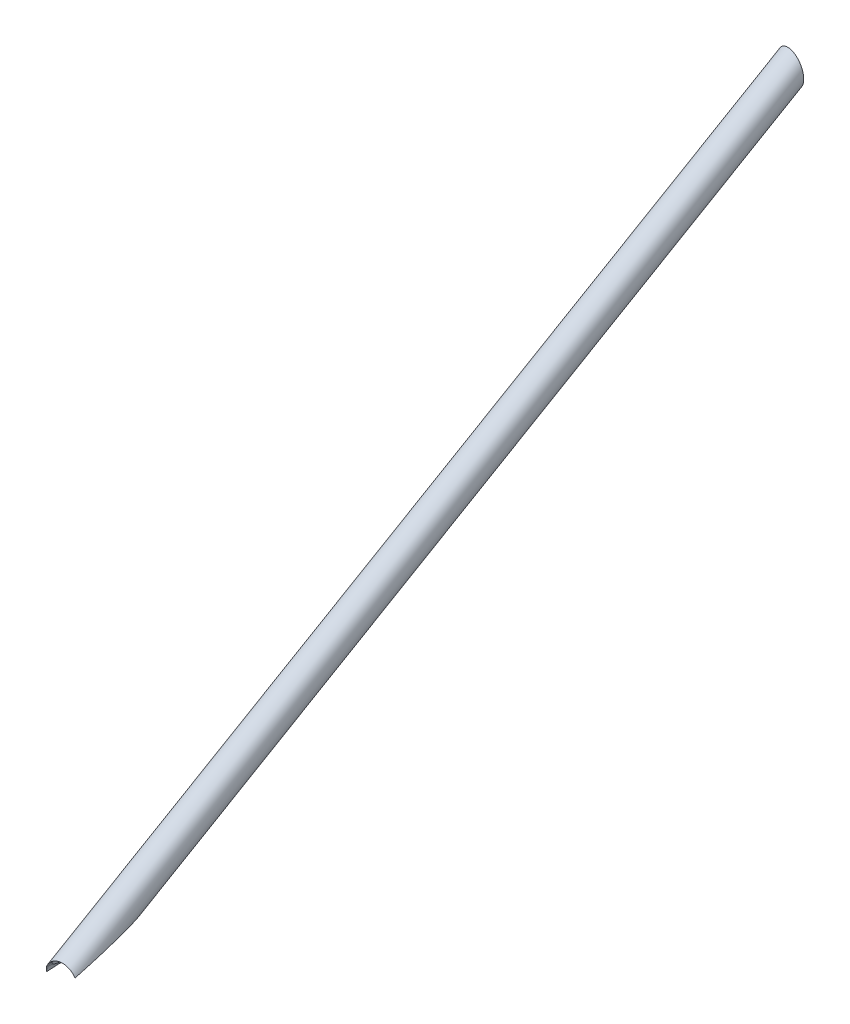
ISO-10303-21;
HEADER;
FILE_DESCRIPTION(('STEP AP214'),'2;1');
FILE_NAME('part.step','',(''),(''),'','','');
FILE_SCHEMA(('AUTOMOTIVE_DESIGN { 1 0 10303 214 1 1 1 1 }'));
ENDSEC;
DATA;
#1=APPLICATION_CONTEXT('core data for automotive mechanical design processes');
#2=APPLICATION_PROTOCOL_DEFINITION('international standard','automotive_design',2000,#1);
#3=PRODUCT_CONTEXT('',#1,'mechanical');
#4=PRODUCT('Part','Part','',(#3));
#5=PRODUCT_RELATED_PRODUCT_CATEGORY('part','',(#4));
#6=PRODUCT_DEFINITION_FORMATION('','',#4);
#7=PRODUCT_DEFINITION_CONTEXT('part definition',#1,'design');
#8=PRODUCT_DEFINITION('design','',#6,#7);
#9=PRODUCT_DEFINITION_SHAPE('','',#8);
#10=(LENGTH_UNIT() NAMED_UNIT(*) SI_UNIT(.MILLI.,.METRE.));
#11=(NAMED_UNIT(*) PLANE_ANGLE_UNIT() SI_UNIT($,.RADIAN.));
#12=(NAMED_UNIT(*) SI_UNIT($,.STERADIAN.) SOLID_ANGLE_UNIT());
#13=UNCERTAINTY_MEASURE_WITH_UNIT(LENGTH_MEASURE(1.E-05),#10,'distance_accuracy_value','');
#14=(GEOMETRIC_REPRESENTATION_CONTEXT(3) GLOBAL_UNCERTAINTY_ASSIGNED_CONTEXT((#13)) GLOBAL_UNIT_ASSIGNED_CONTEXT((#10,
#11,#12)) REPRESENTATION_CONTEXT('',''));
#15=CARTESIAN_POINT('',(0.,0.,0.));
#16=DIRECTION('',(0.,0.,1.));
#17=DIRECTION('',(1.,0.,0.));
#18=AXIS2_PLACEMENT_3D('',#15,#16,#17);
#19=CARTESIAN_POINT('',(159.999999999996,499.999999999997,-1140.));
#20=DIRECTION('',(0.0860700691861919,-0.397246473166977,0.913666888284063));
#21=DIRECTION('',(0.,-0.917070056253238,-0.398726111414444));
#22=AXIS2_PLACEMENT_3D('',#19,#20,#21);
#23=CYLINDRICAL_SURFACE('',#22,11.3);
#24=CARTESIAN_POINT('',(159.999999999996,499.999999999997,-1140.));
#25=DIRECTION('',(0.133991346812795,0.0219122293107126,-0.990740214781821));
#26=DIRECTION('',(0.480296136468897,-0.875921056969798,0.0455842434396295));
#27=AXIS2_PLACEMENT_3D('',#24,#25,#26);
#28=ELLIPSE('',#27,12.5224622988998,11.3);
#29=CARTESIAN_POINT('',(166.014490261235,489.03131158728,-1139.4291730301));
#30=VERTEX_POINT('',#29);
#31=EDGE_CURVE('E112',#30,#30,#28,.T.);
#32=ORIENTED_EDGE('',*,*,#31,.T.);
#33=EDGE_LOOP('',(#32));
#34=FACE_BOUND('',#33,.T.);
#35=CARTESIAN_POINT('',(219.876049960598,213.286108546212,-508.898305477288));
#36=CARTESIAN_POINT('',(219.925483847291,213.354795721992,-509.056281000279));
#37=CARTESIAN_POINT('',(219.975743548204,213.423883720816,-509.2138220252));
#38=CARTESIAN_POINT('',(220.078066840447,213.562925288516,-509.527935243912));
#39=CARTESIAN_POINT('',(220.130130449182,213.63287886574,-509.684507428336));
#40=CARTESIAN_POINT('',(220.289264202963,213.844150460932,-510.152666870754));
#41=CARTESIAN_POINT('',(220.399261495153,213.986857322774,-510.462646218657));
#42=CARTESIAN_POINT('',(220.62878344918,214.276818323832,-511.077654730416));
#43=CARTESIAN_POINT('',(220.748324425629,214.42407997426,-511.382674296276));
#44=CARTESIAN_POINT('',(220.998849656438,214.723684984896,-511.985406548575));
#45=CARTESIAN_POINT('',(221.129831133415,214.87602710621,-512.283120986106));
#46=CARTESIAN_POINT('',(221.36002583754,215.134861783579,-512.77047294297));
#47=CARTESIAN_POINT('',(221.455196795115,215.239632171699,-512.962929319024));
#48=CARTESIAN_POINT('',(221.653207676307,215.452315624128,-513.342055814529));
#49=CARTESIAN_POINT('',(221.756046036483,215.560228045033,-513.528727102671));
#50=CARTESIAN_POINT('',(221.97073552698,215.779387311004,-513.893895588268));
#51=CARTESIAN_POINT('',(222.082558845123,215.890623244288,-514.072415516781));
#52=CARTESIAN_POINT('',(222.317635528396,216.117255739658,-514.418890915909));
#53=CARTESIAN_POINT('',(222.440879837971,216.232648961853,-514.586854582074));
#54=CARTESIAN_POINT('',(222.677468191565,216.446208517778,-514.877565358464));
#55=CARTESIAN_POINT('',(222.788348152903,216.543557008199,-515.002891667427));
#56=CARTESIAN_POINT('',(223.022116940828,216.741885969738,-515.239613409516));
#57=CARTESIAN_POINT('',(223.145030630377,216.842873675927,-515.350978868094));
#58=CARTESIAN_POINT('',(223.406901663051,217.049502941763,-515.554362570307));
#59=CARTESIAN_POINT('',(223.546067378769,217.155190967004,-515.646073996865));
#60=CARTESIAN_POINT('',(223.840274307233,217.367734322353,-515.796752651344));
#61=CARTESIAN_POINT('',(223.99523293654,217.474581208905,-515.855880803837));
#62=CARTESIAN_POINT('',(224.2563517605,217.644194274855,-515.914159888442));
#63=CARTESIAN_POINT('',(224.358492535157,217.70818171871,-515.927604119596));
#64=CARTESIAN_POINT('',(224.565514530137,217.832706713189,-515.934379784523));
#65=CARTESIAN_POINT('',(224.670393076434,217.893247458978,-515.927730165574));
#66=CARTESIAN_POINT('',(224.879896537269,218.008952203589,-515.893723428398));
#67=CARTESIAN_POINT('',(224.984521058141,218.064110354605,-515.866344065415));
#68=CARTESIAN_POINT('',(225.190421952512,218.167676293351,-515.792706355293));
#69=CARTESIAN_POINT('',(225.291694597986,218.216076745588,-515.746427703489));
#70=CARTESIAN_POINT('',(225.523878503193,218.321690650928,-515.619110029616));
#71=CARTESIAN_POINT('',(225.652538077436,218.37592670027,-515.531562873306));
#72=CARTESIAN_POINT('',(225.898558616638,218.47265436529,-515.336457772622));
#73=CARTESIAN_POINT('',(226.015890706233,218.51511645729,-515.228850635802));
#74=CARTESIAN_POINT('',(226.22872585918,218.586582643463,-515.011580401279));
#75=CARTESIAN_POINT('',(226.325239693355,218.616504075181,-514.903180914467));
#76=CARTESIAN_POINT('',(226.510720886693,218.669904405286,-514.678543214707));
#77=CARTESIAN_POINT('',(226.599681451611,218.69337754491,-514.562298109738));
#78=CARTESIAN_POINT('',(226.771226427924,218.735068652841,-514.323915263817));
#79=CARTESIAN_POINT('',(226.85379483723,218.753273726094,-514.20176390369));
#80=CARTESIAN_POINT('',(227.013214539706,218.785266225028,-513.95333237767));
#81=CARTESIAN_POINT('',(227.090068038699,218.799055362026,-513.827053832152));
#82=CARTESIAN_POINT('',(227.285285604304,218.830409865983,-513.49163067168));
#83=CARTESIAN_POINT('',(227.399667170497,218.844972274591,-513.279892786182));
#84=CARTESIAN_POINT('',(227.618222522899,218.86667177593,-512.850792739816));
#85=CARTESIAN_POINT('',(227.722390312397,218.873804529933,-512.633427368479));
#86=CARTESIAN_POINT('',(227.922529896055,218.882170335478,-512.194372779457));
#87=CARTESIAN_POINT('',(228.018485679605,218.883392108951,-511.972676105855));
#88=CARTESIAN_POINT('',(228.203396096181,218.881011923628,-511.526401730432));
#89=CARTESIAN_POINT('',(228.292349883475,218.877409383074,-511.301823684384));
#90=CARTESIAN_POINT('',(228.464777897356,218.866162584633,-510.849289578295));
#91=CARTESIAN_POINT('',(228.548219749185,218.858496487714,-510.621321797597));
#92=CARTESIAN_POINT('',(228.70993358325,218.839734538828,-510.163698068505));
#93=CARTESIAN_POINT('',(228.78820533292,218.828638532699,-509.934042044684));
#94=CARTESIAN_POINT('',(228.940135950033,218.803519019055,-509.473713773384));
#95=CARTESIAN_POINT('',(229.013800819428,218.789499428284,-509.243043285669));
#96=CARTESIAN_POINT('',(229.157150120026,218.758902453354,-508.780651350185));
#97=CARTESIAN_POINT('',(229.226834667127,218.742325143724,-508.548929933229));
#98=CARTESIAN_POINT('',(229.452072938836,218.683643673105,-507.779082995882));
#99=CARTESIAN_POINT('',(229.599936405978,218.636657636731,-507.239070452929));
#100=CARTESIAN_POINT('',(229.880721290548,218.533479712115,-506.156018199092));
#101=CARTESIAN_POINT('',(230.013640050122,218.477286190712,-505.612977967714));
#102=CARTESIAN_POINT('',(230.267226539909,218.357502214029,-504.524546597768));
#103=CARTESIAN_POINT('',(230.387887320536,218.293907606098,-503.979154306345));
#104=CARTESIAN_POINT('',(230.618786688123,218.160673019389,-502.886900046595));
#105=CARTESIAN_POINT('',(230.729024897267,218.091032821634,-502.340038025728));
#106=CARTESIAN_POINT('',(230.9407484778,217.946514520237,-501.24388995115));
#107=CARTESIAN_POINT('',(231.042211447372,217.871623846081,-500.694601249779));
#108=CARTESIAN_POINT('',(231.237161487312,217.717524053851,-499.595213400973));
#109=CARTESIAN_POINT('',(231.330648444191,217.638314874355,-499.045114242119));
#110=CARTESIAN_POINT('',(231.510456671233,217.476217350201,-497.944487957565));
#111=CARTESIAN_POINT('',(231.596780376033,217.393330270404,-497.393961041995));
#112=CARTESIAN_POINT('',(231.762955915961,217.224348379031,-496.292421784065));
#113=CARTESIAN_POINT('',(231.842807679011,217.138253531744,-495.741409436368));
#114=CARTESIAN_POINT('',(232.073408207127,216.875879416308,-494.088280277031));
#115=CARTESIAN_POINT('',(232.21528162289,216.695437254493,-492.985578755008));
#116=CARTESIAN_POINT('',(232.47842011601,216.326189568441,-490.779060760109));
#117=CARTESIAN_POINT('',(232.599683521467,216.13738336727,-489.675244204079));
#118=CARTESIAN_POINT('',(232.82331024652,215.753926702244,-487.468217789496));
#119=CARTESIAN_POINT('',(232.925698008437,215.559284181313,-486.365009017099));
#120=CARTESIAN_POINT('',(233.112771637147,215.166043515642,-484.157843653582));
#121=CARTESIAN_POINT('',(233.197458145979,214.967445514657,-483.053887091041));
#122=CARTESIAN_POINT('',(233.34999173763,214.566769945998,-480.83536301875));
#123=CARTESIAN_POINT('',(233.417684042085,214.364677137596,-479.720787639081));
#124=CARTESIAN_POINT('',(233.534539242325,213.961403345726,-477.490184511493));
#125=CARTESIAN_POINT('',(233.583697345761,213.760222611357,-476.374156462711));
#126=CARTESIAN_POINT('',(233.641884855822,213.462085210361,-474.699630694322));
#127=CARTESIAN_POINT('',(233.658683639587,213.363370047527,-474.141710942744));
#128=CARTESIAN_POINT('',(233.686642858698,213.167735037206,-473.025417681185));
#129=CARTESIAN_POINT('',(233.697803351947,213.070815171291,-472.467044175923));
#130=CARTESIAN_POINT('',(233.713857728423,212.879536360676,-471.349852959252));
#131=CARTESIAN_POINT('',(233.718752574382,212.785177024726,-470.791035329292));
#132=CARTESIAN_POINT('',(233.721387799686,212.599970863645,-469.67280770565));
#133=CARTESIAN_POINT('',(233.719128325065,212.509123966857,-469.113397724294));
#134=CARTESIAN_POINT('',(233.705719172725,212.325443170864,-467.951243217114));
#135=CARTESIAN_POINT('',(233.693905017346,212.232985586297,-467.348445582643));
#136=CARTESIAN_POINT('',(233.658285527689,212.055665048514,-466.141984976343));
#137=CARTESIAN_POINT('',(233.634478562836,211.970803129875,-465.538321897977));
#138=CARTESIAN_POINT('',(233.571471509294,211.811512682192,-464.329750954654));
#139=CARTESIAN_POINT('',(233.532256794201,211.737094158315,-463.724842451801));
#140=CARTESIAN_POINT('',(233.457884911381,211.636542902001,-462.817582502284));
#141=CARTESIAN_POINT('',(233.430505874369,211.604874302839,-462.515207395857));
#142=CARTESIAN_POINT('',(233.369597136521,211.54593407277,-461.910655457981));
#143=CARTESIAN_POINT('',(233.336067767226,211.518662205,-461.608478616725));
#144=CARTESIAN_POINT('',(233.25292959212,211.463507626725,-460.933376653296));
#145=CARTESIAN_POINT('',(233.201393548545,211.436996990799,-460.56056915432));
#146=CARTESIAN_POINT('',(233.084276852094,211.393810286172,-459.816621254665));
#147=CARTESIAN_POINT('',(233.018699538162,211.377131882948,-459.445480479032));
#148=CARTESIAN_POINT('',(232.869731226715,211.35587215361,-458.706872137177));
#149=CARTESIAN_POINT('',(232.786364213218,211.351274650084,-458.339400315881));
#150=CARTESIAN_POINT('',(232.596784162261,211.35666937071,-457.610485423296));
#151=CARTESIAN_POINT('',(232.490583558213,211.366653671806,-457.249039185899));
#152=CARTESIAN_POINT('',(232.291110460768,211.397125466432,-456.660264600484));
#153=CARTESIAN_POINT('',(232.2061219183,211.412771174672,-456.429885120939));
#154=CARTESIAN_POINT('',(232.022008616392,211.451671214212,-455.975538574155));
#155=CARTESIAN_POINT('',(231.92288929239,211.474922624393,-455.751569080894));
#156=CARTESIAN_POINT('',(231.709045020026,211.529005656437,-455.312653795401));
#157=CARTESIAN_POINT('',(231.594351559043,211.559822082581,-455.097690912789));
#158=CARTESIAN_POINT('',(231.347972662609,211.628485275084,-454.678871011232));
#159=CARTESIAN_POINT('',(231.216288305414,211.666331595387,-454.475013288712));
#160=CARTESIAN_POINT('',(230.933992686421,211.748160926947,-454.078976333881));
#161=CARTESIAN_POINT('',(230.783206451157,211.792201148344,-453.886933183874));
#162=CARTESIAN_POINT('',(230.464119961216,211.884051578892,-453.518956398487));
#163=CARTESIAN_POINT('',(230.295819301996,211.931861875116,-453.343023135387));
#164=CARTESIAN_POINT('',(229.942738835498,212.028711761326,-453.008480807552));
#165=CARTESIAN_POINT('',(229.757939037063,212.077752789378,-452.849893291697));
#166=CARTESIAN_POINT('',(229.37389649723,212.174219551731,-452.550776578397));
#167=CARTESIAN_POINT('',(229.174653498961,212.22164525728,-452.410247702247));
#168=CARTESIAN_POINT('',(228.786450602707,212.307256343747,-452.161393426781));
#169=CARTESIAN_POINT('',(228.598760907304,212.345884643875,-452.051226420655));
#170=CARTESIAN_POINT('',(228.215211646566,212.418111212278,-451.844366498072));
#171=CARTESIAN_POINT('',(228.019352965422,212.451710023136,-451.74767212826));
#172=CARTESIAN_POINT('',(227.620900085147,212.512488345484,-451.566961657946));
#173=CARTESIAN_POINT('',(227.418305157465,212.539667160033,-451.482946934276));
#174=CARTESIAN_POINT('',(227.007740257453,212.586463763276,-451.326752326874));
#175=CARTESIAN_POINT('',(226.799769568964,212.606080538956,-451.254574029498));
#176=CARTESIAN_POINT('',(226.342343079692,212.639568770696,-451.109361940349));
#177=CARTESIAN_POINT('',(226.092088002878,212.651797692433,-451.038459508432));
#178=CARTESIAN_POINT('',(225.587734903475,212.66334611893,-450.910667479419));
#179=CARTESIAN_POINT('',(225.333636570241,212.662664574524,-450.853779021548));
#180=CARTESIAN_POINT('',(224.823190915034,212.647569215296,-450.752888966558));
#181=CARTESIAN_POINT('',(224.566842682469,212.633149559862,-450.708892860889));
#182=CARTESIAN_POINT('',(224.053570184072,212.590009739315,-450.632871461234));
#183=CARTESIAN_POINT('',(223.796645877013,212.56128851597,-450.60084705339));
#184=CARTESIAN_POINT('',(223.244838165492,212.483732779625,-450.543967412825));
#185=CARTESIAN_POINT('',(222.950098680981,212.432510968982,-450.520932382883));
#186=CARTESIAN_POINT('',(222.363940796752,212.310411177595,-450.488678787195));
#187=CARTESIAN_POINT('',(222.072522707355,212.23953137561,-450.47946150212));
#188=CARTESIAN_POINT('',(221.494951749181,212.078147786716,-450.474045971556));
#189=CARTESIAN_POINT('',(221.208800510178,211.987638032698,-450.477851690008));
#190=CARTESIAN_POINT('',(220.6437859816,211.787312239196,-450.497858610573));
#191=CARTESIAN_POINT('',(220.364922736928,211.677496080794,-450.514059889038));
#192=CARTESIAN_POINT('',(219.803508482482,211.433517661443,-450.559405679954));
#193=CARTESIAN_POINT('',(219.521392527506,211.298458499955,-450.589118849586));
#194=CARTESIAN_POINT('',(218.969150954783,211.008620553388,-450.661186481979));
#195=CARTESIAN_POINT('',(218.699025794083,210.853841017506,-450.703541426124));
#196=CARTESIAN_POINT('',(218.172665531272,210.525670949586,-450.800636150435));
#197=CARTESIAN_POINT('',(217.916430283338,210.352280612991,-450.855375800548));
#198=CARTESIAN_POINT('',(217.419620983049,209.988237363405,-450.977135676387));
#199=CARTESIAN_POINT('',(217.179046832643,209.79758455851,-451.044155825217));
#200=CARTESIAN_POINT('',(216.713793842724,209.399407960108,-451.190982174973));
#201=CARTESIAN_POINT('',(216.489220069868,209.191789002385,-451.270863338522));
#202=CARTESIAN_POINT('',(216.059110197869,208.762584482455,-451.443375213879));
#203=CARTESIAN_POINT('',(215.853574429653,208.540998677583,-451.536006147241));
#204=CARTESIAN_POINT('',(215.462792683888,208.085915504667,-451.734564329133));
#205=CARTESIAN_POINT('',(215.277559764066,207.852410610732,-451.840500041716));
#206=CARTESIAN_POINT('',(214.928740338,207.376182659035,-452.066375861258));
#207=CARTESIAN_POINT('',(214.765153215069,207.133459864144,-452.186315569061));
#208=CARTESIAN_POINT('',(214.462429046563,206.64471395106,-452.439758182759));
#209=CARTESIAN_POINT('',(214.323024501257,206.398764350424,-452.573082933988));
#210=CARTESIAN_POINT('',(214.067028139769,205.904185308628,-452.855843762675));
#211=CARTESIAN_POINT('',(213.95043865853,205.655555595924,-453.005281486743));
#212=CARTESIAN_POINT('',(213.740665479248,205.160149753458,-453.321681052767));
#213=CARTESIAN_POINT('',(213.647445431026,204.913371331525,-453.488615099033));
#214=CARTESIAN_POINT('',(213.484172274983,204.426255788394,-453.842023567649));
#215=CARTESIAN_POINT('',(213.414109346795,204.185915976577,-454.028489662639));
#216=CARTESIAN_POINT('',(213.312628805839,203.78198112582,-454.368345251961));
#217=CARTESIAN_POINT('',(213.275882213509,203.61547351474,-454.516708592721));
#218=CARTESIAN_POINT('',(213.213607896478,203.29130679262,-454.824981481));
#219=CARTESIAN_POINT('',(213.188077264293,203.133645397652,-454.984888023675));
#220=CARTESIAN_POINT('',(213.147429122704,202.829837865328,-455.316067447979));
#221=CARTESIAN_POINT('',(213.132294792775,202.683673467558,-455.48732147546));
#222=CARTESIAN_POINT('',(213.111242104672,202.404811335159,-455.841014692982));
#223=CARTESIAN_POINT('',(213.105323819237,202.272113706823,-456.023453971288));
#224=CARTESIAN_POINT('',(213.101321482522,202.021821031925,-456.398744830412));
#225=CARTESIAN_POINT('',(213.103244958101,201.904240607192,-456.591606239595));
#226=CARTESIAN_POINT('',(213.113415996338,201.685354629162,-456.986167904092));
#227=CARTESIAN_POINT('',(213.121663507842,201.584048944229,-457.187868087899));
#228=CARTESIAN_POINT('',(213.142969371147,201.397823008637,-457.598596536428));
#229=CARTESIAN_POINT('',(213.15603124308,201.31291481679,-457.80763006165));
#230=CARTESIAN_POINT('',(213.18559567098,201.158983487911,-458.231204759987));
#231=CARTESIAN_POINT('',(213.202098704346,201.089962557754,-458.445746693672));
#232=CARTESIAN_POINT('',(213.247731164305,200.930539474166,-459.005830298465));
#233=CARTESIAN_POINT('',(213.278590427086,200.851328521801,-459.354426337332));
#234=CARTESIAN_POINT('',(213.342795234776,200.724186945983,-460.057035742599));
#235=CARTESIAN_POINT('',(213.376142633055,200.676279904788,-460.411052987981));
#236=CARTESIAN_POINT('',(213.443630601804,200.605626439145,-461.12302160955));
#237=CARTESIAN_POINT('',(213.477774044908,200.582993102365,-461.48098348751));
#238=CARTESIAN_POINT('',(213.528762423186,200.564326399069,-462.018307023362));
#239=CARTESIAN_POINT('',(213.545718387431,200.560650825518,-462.197453149221));
#240=CARTESIAN_POINT('',(213.579503600528,200.557853348438,-462.555791630179));
#241=CARTESIAN_POINT('',(213.596332852342,200.558731338106,-462.734983984096));
#242=CARTESIAN_POINT('',(213.64599666725,200.567345044023,-463.266401779288));
#243=CARTESIAN_POINT('',(213.678587650276,200.580886145834,-463.618558635662));
#244=CARTESIAN_POINT('',(213.743002478129,200.62055078399,-464.322256598955));
#245=CARTESIAN_POINT('',(213.774826169294,200.64667681903,-464.673797569675));
#246=CARTESIAN_POINT('',(213.837762095136,200.709179804435,-465.376254098663));
#247=CARTESIAN_POINT('',(213.868873839828,200.745563597948,-465.727169081519));
#248=CARTESIAN_POINT('',(213.930469819197,200.826753328432,-466.428089345527));
#249=CARTESIAN_POINT('',(213.960954010215,200.871559849199,-466.778094561915));
#250=CARTESIAN_POINT('',(214.021505721047,200.968305239608,-467.478098143404));
#251=CARTESIAN_POINT('',(214.051571923281,201.020262687284,-467.828094034607));
#252=CARTESIAN_POINT('',(214.11134556521,201.130113784095,-468.527187710347));
#253=CARTESIAN_POINT('',(214.141052993856,201.188007615502,-468.876285466971));
#254=CARTESIAN_POINT('',(214.229821363749,201.369177364456,-469.922009963377));
#255=CARTESIAN_POINT('',(214.288553531711,201.499983689381,-470.61736121903));
#256=CARTESIAN_POINT('',(214.406510895928,201.777483127279,-472.009456657939));
#257=CARTESIAN_POINT('',(214.465736842288,201.924272536282,-472.706181285747));
#258=CARTESIAN_POINT('',(214.585166183547,202.229751663762,-474.096982623416));
#259=CARTESIAN_POINT('',(214.645369658598,202.388442361993,-474.79105911032));
#260=CARTESIAN_POINT('',(214.767353892222,202.715149034602,-476.175500388541));
#261=CARTESIAN_POINT('',(214.829131528372,202.883147222898,-476.865869670002));
#262=CARTESIAN_POINT('',(214.954985742852,203.227188445362,-478.244396633134));
#263=CARTESIAN_POINT('',(215.019062352718,203.403231589893,-478.932554284326));
#264=CARTESIAN_POINT('',(215.144613539343,203.747342534846,-480.249642174652));
#265=CARTESIAN_POINT('',(215.205861413354,203.914856227806,-480.878739022751));
#266=CARTESIAN_POINT('',(215.331139919571,204.255135947886,-482.13523433627));
#267=CARTESIAN_POINT('',(215.39517056798,204.427902005585,-482.762632791778));
#268=CARTESIAN_POINT('',(215.592009514091,204.95341121214,-484.642383555132));
#269=CARTESIAN_POINT('',(215.729559732404,205.313351207368,-485.892237286202));
#270=CARTESIAN_POINT('',(216.020609126874,206.051003408975,-488.387223812114));
#271=CARTESIAN_POINT('',(216.174135568626,206.428745375408,-489.632344648983));
#272=CARTESIAN_POINT('',(216.418876869443,207.007822121066,-491.49418223575));
#273=CARTESIAN_POINT('',(216.502862598878,207.202917695026,-492.113798436636));
#274=CARTESIAN_POINT('',(216.676183465877,207.597317852378,-493.350937510879));
#275=CARTESIAN_POINT('',(216.765518557001,207.796622399219,-493.96846040236));
#276=CARTESIAN_POINT('',(216.949357798212,208.197846760351,-495.196009321725));
#277=CARTESIAN_POINT('',(217.04381200239,208.399730344549,-495.806054654288));
#278=CARTESIAN_POINT('',(217.239258525862,208.807919922479,-497.02360945753));
#279=CARTESIAN_POINT('',(217.34025077383,209.01422586795,-497.631118955796));
#280=CARTESIAN_POINT('',(217.549643261634,209.431603028171,-498.843465021885));
#281=CARTESIAN_POINT('',(217.658046065422,209.642675875117,-499.448300586714));
#282=CARTESIAN_POINT('',(217.883255802953,210.069889335272,-500.654605304179));
#283=CARTESIAN_POINT('',(218.000062610765,210.286029872509,-501.256074507112));
#284=CARTESIAN_POINT('',(218.243114433572,210.723405161195,-502.453678732504));
#285=CARTESIAN_POINT('',(218.369337840924,210.944627490126,-503.049822653696));
#286=CARTESIAN_POINT('',(218.633132892161,211.393312870301,-504.237226530853));
#287=CARTESIAN_POINT('',(218.770704122608,211.620775693981,-504.828486663888));
#288=CARTESIAN_POINT('',(219.059395861502,212.082768147777,-506.004516350871));
#289=CARTESIAN_POINT('',(219.210508606021,212.317293677972,-506.589289410712));
#290=CARTESIAN_POINT('',(219.529503809407,212.794838083263,-507.750701071363));
#291=CARTESIAN_POINT('',(219.697383136653,213.037855366799,-508.327341168352));
#292=CARTESIAN_POINT('',(219.876049960598,213.286108546212,-508.898305477288));
#293=B_SPLINE_CURVE_WITH_KNOTS('',3,(#35,#36,#37,#38,#39,#40,#41,#42,#43,#44,#45,#46,#47,#48,
#49,#50,#51,#52,#53,#54,#55,#56,#57,#58,#59,#60,#61,#62,#63,#64,#65,#66,#67,#68,#69,#70,#71,#72,
#73,#74,#75,#76,#77,#78,#79,#80,#81,#82,#83,#84,#85,#86,#87,#88,#89,#90,#91,#92,#93,#94,#95,#96,
#97,#98,#99,#100,#101,#102,#103,#104,#105,#106,#107,#108,#109,#110,#111,#112,#113,#114,#115,
#116,#117,#118,#119,#120,#121,#122,#123,#124,#125,#126,#127,#128,#129,#130,#131,#132,#133,#134,
#135,#136,#137,#138,#139,#140,#141,#142,#143,#144,#145,#146,#147,#148,#149,#150,#151,#152,#153,
#154,#155,#156,#157,#158,#159,#160,#161,#162,#163,#164,#165,#166,#167,#168,#169,#170,#171,#172,
#173,#174,#175,#176,#177,#178,#179,#180,#181,#182,#183,#184,#185,#186,#187,#188,#189,#190,#191,
#192,#193,#194,#195,#196,#197,#198,#199,#200,#201,#202,#203,#204,#205,#206,#207,#208,#209,#210,
#211,#212,#213,#214,#215,#216,#217,#218,#219,#220,#221,#222,#223,#224,#225,#226,#227,#228,#229,
#230,#231,#232,#233,#234,#235,#236,#237,#238,#239,#240,#241,#242,#243,#244,#245,#246,#247,#248,
#249,#250,#251,#252,#253,#254,#255,#256,#257,#258,#259,#260,#261,#262,#263,#264,#265,#266,#267,
#268,#269,#270,#271,#272,#273,#274,#275,#276,#277,#278,#279,#280,#281,#282,#283,#284,#285,#286,
#287,#288,#289,#290,#291,#292),.UNSPECIFIED.,.T.,.F.,(4,2,2,2,2,2,2,2,2,2,2,2,2,2,2,2,2,2,2,2,2,
2,2,2,2,2,2,2,2,2,2,2,2,2,2,2,2,2,2,2,2,2,2,2,2,2,2,2,2,2,2,2,2,2,2,2,2,2,2,2,2,2,2,2,2,2,2,2,2,
2,2,2,2,2,2,2,2,2,2,2,2,2,2,2,2,2,2,2,2,2,2,2,2,2,2,2,2,2,2,2,2,2,2,2,2,2,2,2,2,2,2,2,2,2,2,2,2,
2,2,2,2,2,2,2,2,2,2,2,4),(0.,0.537636843059655,1.07527887495949,2.15073560202311,
3.22807185881656,4.3051472962898,5.0216866354496,5.73808026445697,6.45233599836051,
7.16603017621673,7.74615116343069,8.32749710595339,8.91734636525075,9.50425571168469,
9.86655947457663,10.2285217136787,10.590872920149,10.9536144512252,11.4452193611822,
11.9380460665429,12.3819688575356,12.8262868222085,13.2716833526098,13.7169070681724,
14.4396242169919,15.1627631779621,15.8872813353265,16.6118868692313,17.3404267806819,
18.0689994417525,18.7966022289547,19.5241838190548,21.2093410537506,22.8947975141434,
24.5812042627482,26.267672119907,27.9583254583797,29.6490028484811,31.3391032392859,
33.0292224501354,36.4079483322121,39.7869481683562,43.1615412782779,46.5360119678559,
49.9401841283883,53.3452358954551,55.0457149768408,56.7461765946266,58.4463769008352,
60.1465425029737,61.976293289641,63.8062929215666,65.638033965066,66.553736444069,
67.4693895753781,68.6009350821608,69.7322118112901,70.8619728853825,71.9911203297386,
72.7287789687557,73.4661546274712,74.2020610808156,74.9379208559328,75.6810883514245,
76.4242730162485,77.1683707077844,77.9124816363343,78.5749513438327,79.2373495323212,
79.8998195963487,80.5623783743522,81.3427856456433,82.1232563368765,82.9040589850875,
83.6849194166443,84.5840357948063,85.4832355006622,86.3827089291786,87.2821878982119,
88.2236364448769,89.1651208455261,90.1065953601039,91.0480639797646,91.9952332106685,
92.942418902623,93.8902102437868,94.837974576684,95.7744739114127,96.711069039408,
97.6461981650491,98.5809302149704,99.2583324172034,99.9355589143692,100.611687106839,
101.287820635568,101.964603299004,102.641380488193,103.318653503686,103.996020541389,
105.070541828767,106.145871657678,107.225994027129,107.765903664127,108.305800637632,
109.367250954601,110.428912105659,111.491283194038,112.55372794458,113.61898693536,
114.684278644186,116.813970333508,118.957288814897,121.100783935507,123.240315492666,
125.379876409695,127.341521921795,129.303178856455,133.226660813131,137.156952093057,
139.121955096443,141.086941043007,143.035355637407,144.983748979651,146.932819885293,
148.881861590582,150.826560930623,152.771189450036,154.714710078616,156.657868377736),.UNSPECIFIED.);
#294=CARTESIAN_POINT('',(214.357776615302,201.662909535807,-471.434286069235));
#295=VERTEX_POINT('',#294);
#296=CARTESIAN_POINT('',(227.588962969013,212.51568478638,-451.555922832176));
#297=VERTEX_POINT('',#296);
#298=EDGE_CURVE('E114',#295,#297,#293,.T.);
#299=ORIENTED_EDGE('',*,*,#298,.T.);
#300=CARTESIAN_POINT('',(222.412475974726,201.579526942547,-481.973167788858));
#301=CARTESIAN_POINT('',(222.564103399446,201.577907630074,-481.969452033575));
#302=CARTESIAN_POINT('',(222.715488624476,201.576228565854,-481.957999386336));
#303=CARTESIAN_POINT('',(223.016460070386,201.572776190408,-481.920468101172));
#304=CARTESIAN_POINT('',(223.166045655939,201.571002847032,-481.894384444361));
#305=CARTESIAN_POINT('',(223.610758050175,201.565577231968,-481.795744766206));
#306=CARTESIAN_POINT('',(223.901443422678,201.561823686849,-481.702814892891));
#307=CARTESIAN_POINT('',(224.563176659631,201.552947754418,-481.434268082292));
#308=CARTESIAN_POINT('',(224.926932348551,201.547804142017,-481.241122108701));
#309=CARTESIAN_POINT('',(225.446588093637,201.54030299004,-480.911766501133));
#310=CARTESIAN_POINT('',(225.615690749751,201.537835084791,-480.795188240557));
#311=CARTESIAN_POINT('',(225.945717702059,201.53300087507,-480.550944892659));
#312=CARTESIAN_POINT('',(226.106642918018,201.530634559176,-480.423281056595));
#313=CARTESIAN_POINT('',(226.554128473787,201.524077863036,-480.046540554966));
#314=CARTESIAN_POINT('',(226.831365536038,201.520044382673,-479.786399734859));
#315=CARTESIAN_POINT('',(227.362887243994,201.512559038167,-479.243569519805));
#316=CARTESIAN_POINT('',(227.617150903652,201.509107703364,-478.960859943653));
#317=CARTESIAN_POINT('',(228.106280651426,201.50289753448,-478.377995454914));
#318=CARTESIAN_POINT('',(228.341094998175,201.500140510133,-478.077797412754));
#319=CARTESIAN_POINT('',(228.793131361261,201.495444679317,-477.464679786962));
#320=CARTESIAN_POINT('',(229.010358997788,201.493505610614,-477.151764315841));
#321=CARTESIAN_POINT('',(229.461687103641,201.490337084433,-476.466977133696));
#322=CARTESIAN_POINT('',(229.693247895611,201.48926253652,-476.093437046763));
#323=CARTESIAN_POINT('',(230.138611076578,201.488566011101,-475.335855811953));
#324=CARTESIAN_POINT('',(230.352408893766,201.488944406374,-474.95181199424));
#325=CARTESIAN_POINT('',(230.764462289167,201.491402615544,-474.174980482472));
#326=CARTESIAN_POINT('',(230.962700786327,201.493484271425,-473.782183770206));
#327=CARTESIAN_POINT('',(231.344989132735,201.499653784236,-472.989828610909));
#328=CARTESIAN_POINT('',(231.529040233267,201.503741464006,-472.590270763989));
#329=CARTESIAN_POINT('',(231.884309276328,201.514301747104,-471.78541682869));
#330=CARTESIAN_POINT('',(232.055523985979,201.52077494882,-471.380119325117));
#331=CARTESIAN_POINT('',(232.386098074415,201.536585673699,-470.564769857382));
#332=CARTESIAN_POINT('',(232.545457101042,201.545923281904,-470.154717752408));
#333=CARTESIAN_POINT('',(232.853016781787,201.568073592077,-469.330852467608));
#334=CARTESIAN_POINT('',(233.001224609325,201.580884035171,-468.917041900949));
#335=CARTESIAN_POINT('',(233.287195481258,201.610792251027,-468.086005047805));
#336=CARTESIAN_POINT('',(233.424958994955,201.627889831004,-467.66877891573));
#337=CARTESIAN_POINT('',(233.697676138092,201.66852623383,-466.808677206576));
#338=CARTESIAN_POINT('',(233.83207147374,201.692364280964,-466.365638523868));
#339=CARTESIAN_POINT('',(234.08999357806,201.747750928001,-465.476840353943));
#340=CARTESIAN_POINT('',(234.213519518835,201.779300114554,-465.031080662233));
#341=CARTESIAN_POINT('',(234.44970284914,201.852621857879,-464.137218579592));
#342=CARTESIAN_POINT('',(234.562353605129,201.894400600126,-463.689114932383));
#343=CARTESIAN_POINT('',(234.776184904088,201.991792627676,-462.791698552623));
#344=CARTESIAN_POINT('',(234.877367691557,202.047403199,-462.342386074346));
#345=CARTESIAN_POINT('',(235.04283980674,202.16137714541,-461.558261173028));
#346=CARTESIAN_POINT('',(235.10996252839,202.215433014092,-461.223428985068));
#347=CARTESIAN_POINT('',(235.236138906534,202.337687454633,-460.554611447463));
#348=CARTESIAN_POINT('',(235.295189417252,202.405891514185,-460.220626477463));
#349=CARTESIAN_POINT('',(235.403373696773,202.560787420103,-459.556071409317));
#350=CARTESIAN_POINT('',(235.45252959849,202.647437091525,-459.225495294945));
#351=CARTESIAN_POINT('',(235.538284339765,202.845342373934,-458.570144951123));
#352=CARTESIAN_POINT('',(235.574895749217,202.956573169041,-458.245365224795));
#353=CARTESIAN_POINT('',(235.618039096548,203.151812240943,-457.755330228325));
#354=CARTESIAN_POINT('',(235.630642886231,203.224451199865,-457.586078419659));
#355=CARTESIAN_POINT('',(235.650032612995,203.379970609917,-457.252035599825));
#356=CARTESIAN_POINT('',(235.656820984976,203.462846758115,-457.08724274972));
#357=CARTESIAN_POINT('',(235.663530299919,203.639515496831,-456.763974255784));
#358=CARTESIAN_POINT('',(235.663468899124,203.733279398729,-456.605483423722));
#359=CARTESIAN_POINT('',(235.655416714278,203.932313227259,-456.29607459737));
#360=CARTESIAN_POINT('',(235.647426465611,204.037582376591,-456.145156092494));
#361=CARTESIAN_POINT('',(235.62236292865,204.260509496881,-455.851056464461));
#362=CARTESIAN_POINT('',(235.605196720627,204.378284147712,-455.707971305329));
#363=CARTESIAN_POINT('',(235.560917252488,204.624197406598,-455.432659025031));
#364=CARTESIAN_POINT('',(235.533804265781,204.752335729708,-455.300431605538));
#365=CARTESIAN_POINT('',(235.469138859979,205.017380890356,-455.047402851071));
#366=CARTESIAN_POINT('',(235.431569286548,205.154301849576,-454.926620732662));
#367=CARTESIAN_POINT('',(235.345947911285,205.434522525063,-454.696750155636));
#368=CARTESIAN_POINT('',(235.297894219736,205.57782338757,-454.587663810425));
#369=CARTESIAN_POINT('',(235.181686850422,205.89545488514,-454.361429251772));
#370=CARTESIAN_POINT('',(235.111459252574,206.070620984839,-454.24652391185));
#371=CARTESIAN_POINT('',(234.957282963671,206.423405475284,-454.030578427472));
#372=CARTESIAN_POINT('',(234.873330925714,206.601024454501,-453.929541676153));
#373=CARTESIAN_POINT('',(234.692316910578,206.956368765931,-453.739131506929));
#374=CARTESIAN_POINT('',(234.595227225662,207.134093510419,-453.649783546304));
#375=CARTESIAN_POINT('',(234.388835433144,207.487192360521,-453.48104765371));
#376=CARTESIAN_POINT('',(234.279529456365,207.662565701583,-453.401662894309));
#377=CARTESIAN_POINT('',(234.004773174089,208.076551747206,-453.221944835059));
#378=CARTESIAN_POINT('',(233.833993925073,208.313300690146,-453.125433971261));
#379=CARTESIAN_POINT('',(233.472001274757,208.775615017699,-452.94465173869));
#380=CARTESIAN_POINT('',(233.280781367798,209.001176808132,-452.860384286887));
#381=CARTESIAN_POINT('',(232.879512257903,209.438420418291,-452.701421148526));
#382=CARTESIAN_POINT('',(232.669465944215,209.650104359218,-452.626723997495));
#383=CARTESIAN_POINT('',(232.23200374234,210.057452990689,-452.484924103058));
#384=CARTESIAN_POINT('',(232.004587646394,210.253117489569,-452.417821450513));
#385=CARTESIAN_POINT('',(231.530752752835,210.629026744988,-452.288956120709));
#386=CARTESIAN_POINT('',(231.284122117682,210.809032874348,-452.22727596648));
#387=CARTESIAN_POINT('',(230.776162094877,211.14894636793,-452.109239808786));
#388=CARTESIAN_POINT('',(230.514832379796,211.308853284176,-452.052883923996));
#389=CARTESIAN_POINT('',(229.979236691354,211.607003842232,-451.94480468834));
#390=CARTESIAN_POINT('',(229.704973078967,211.745251418011,-451.893080496956));
#391=CARTESIAN_POINT('',(229.145294565716,211.998774991509,-451.793796677598));
#392=CARTESIAN_POINT('',(228.859879598886,212.114050853313,-451.746237074267));
#393=CARTESIAN_POINT('',(228.272595379206,212.323069892228,-451.65387393704));
#394=CARTESIAN_POINT('',(227.970493194272,212.416203212466,-451.60916893416));
#395=CARTESIAN_POINT('',(227.358840610889,212.57614938594,-451.523725351596));
#396=CARTESIAN_POINT('',(227.049290042372,212.642961637582,-451.482986862587));
#397=CARTESIAN_POINT('',(226.425076009671,212.749545811741,-451.405482697814));
#398=CARTESIAN_POINT('',(226.110412565743,212.789317841359,-451.368717006315));
#399=CARTESIAN_POINT('',(225.478377926968,212.841391868255,-451.299273429493));
#400=CARTESIAN_POINT('',(225.161006809416,212.853694647076,-451.266595427894));
#401=CARTESIAN_POINT('',(224.535442783489,212.850752613971,-451.206445589633));
#402=CARTESIAN_POINT('',(224.227257868576,212.836316873652,-451.178847740617));
#403=CARTESIAN_POINT('',(223.612833801883,212.781634009767,-451.127967513748));
#404=CARTESIAN_POINT('',(223.306594610432,212.741387414155,-451.104685047639));
#405=CARTESIAN_POINT('',(222.698264982544,212.635517910243,-451.062787498069));
#406=CARTESIAN_POINT('',(222.396173905204,212.569898968842,-451.044171685741));
#407=CARTESIAN_POINT('',(221.798160923281,212.413963775721,-451.012037284026));
#408=CARTESIAN_POINT('',(221.502239059046,212.323647362533,-450.998518727968));
#409=CARTESIAN_POINT('',(220.918595994208,212.119257529558,-450.977118042525));
#410=CARTESIAN_POINT('',(220.63087278283,212.005189992907,-450.969234519486));
#411=CARTESIAN_POINT('',(220.065367116276,211.754412713866,-450.959762220414));
#412=CARTESIAN_POINT('',(219.787584712163,211.617702855188,-450.95817347671));
#413=CARTESIAN_POINT('',(219.243456917047,211.322873817524,-450.962123774745));
#414=CARTESIAN_POINT('',(218.977118806537,211.164741268132,-450.967667286399));
#415=CARTESIAN_POINT('',(218.457580772575,210.828651216809,-450.986951052951));
#416=CARTESIAN_POINT('',(218.204380769777,210.65069383463,-451.000691258339));
#417=CARTESIAN_POINT('',(217.704747397194,210.270785388986,-451.038323524221));
#418=CARTESIAN_POINT('',(217.458776070453,210.068256424812,-451.062520775221));
#419=CARTESIAN_POINT('',(216.983551870162,209.646022102748,-451.123093762511));
#420=CARTESIAN_POINT('',(216.754302111225,209.426313560645,-451.159471760609));
#421=CARTESIAN_POINT('',(216.313921011373,208.972407012777,-451.247062177389));
#422=CARTESIAN_POINT('',(216.102779803122,208.738217019227,-451.298266449816));
#423=CARTESIAN_POINT('',(215.699699331563,208.258409989017,-451.419112023494));
#424=CARTESIAN_POINT('',(215.507750557508,208.012798701438,-451.488744129878));
#425=CARTESIAN_POINT('',(215.209962556988,207.604520530627,-451.621844425087));
#426=CARTESIAN_POINT('',(215.098088141556,207.443982654763,-451.678433546835));
#427=CARTESIAN_POINT('',(214.882948532747,207.121418949129,-451.80260088807));
#428=CARTESIAN_POINT('',(214.779680669176,206.959393598301,-451.870175679894));
#429=CARTESIAN_POINT('',(214.582280587218,206.635969669309,-452.017809871782));
#430=CARTESIAN_POINT('',(214.48812937016,206.474570491273,-452.097842360913));
#431=CARTESIAN_POINT('',(214.309066421791,206.154315439286,-452.272126864681));
#432=CARTESIAN_POINT('',(214.224152743884,205.995459035545,-452.366375873487));
#433=CARTESIAN_POINT('',(214.07745068612,205.709482177283,-452.553101415779));
#434=CARTESIAN_POINT('',(214.014182606829,205.581548210523,-452.643168203271));
#435=CARTESIAN_POINT('',(213.894312833447,205.330966544759,-452.834415104668));
#436=CARTESIAN_POINT('',(213.837710201534,205.208318103629,-452.935593651278));
#437=CARTESIAN_POINT('',(213.731195813066,204.970033330427,-453.148910040221));
#438=CARTESIAN_POINT('',(213.681278289437,204.854391002147,-453.261038290211));
#439=CARTESIAN_POINT('',(213.587899612672,204.631368138579,-453.495718851143));
#440=CARTESIAN_POINT('',(213.544438625591,204.523987815814,-453.618271430059));
#441=CARTESIAN_POINT('',(213.463756118433,204.318725366873,-453.872306028833));
#442=CARTESIAN_POINT('',(213.426515353459,204.220814354596,-454.00375866944));
#443=CARTESIAN_POINT('',(213.357621966179,204.034453566704,-454.274568714195));
#444=CARTESIAN_POINT('',(213.325969522626,203.946004093771,-454.413926371011));
#445=CARTESIAN_POINT('',(213.267650550628,203.778301471431,-454.69927685315));
#446=CARTESIAN_POINT('',(213.240990240004,203.699059836583,-454.845277675183));
#447=CARTESIAN_POINT('',(213.192124094039,203.549356712008,-455.14240608354));
#448=CARTESIAN_POINT('',(213.169918609032,203.478895912982,-455.29353407198));
#449=CARTESIAN_POINT('',(213.110099573976,203.282687983665,-455.745588544791));
#450=CARTESIAN_POINT('',(213.077947126939,203.168180851053,-456.05213136722));
#451=CARTESIAN_POINT('',(213.025097111188,202.963311342836,-456.674160219303));
#452=CARTESIAN_POINT('',(213.004411977841,202.872975233424,-456.989655569178));
#453=CARTESIAN_POINT('',(212.972157959996,202.710468094133,-457.627324673204));
#454=CARTESIAN_POINT('',(212.960634502877,202.63838877593,-457.94952367673));
#455=CARTESIAN_POINT('',(212.949198310862,202.541048088298,-458.434954246077));
#456=CARTESIAN_POINT('',(212.946361061492,202.510402828542,-458.597085832974));
#457=CARTESIAN_POINT('',(212.942508948222,202.452263595021,-458.921937463117));
#458=CARTESIAN_POINT('',(212.941494083718,202.424769620211,-459.084657506167));
#459=CARTESIAN_POINT('',(212.941051776171,202.35186856475,-459.539508460996));
#460=CARTESIAN_POINT('',(212.943516520918,202.309507146363,-459.832130119116));
#461=CARTESIAN_POINT('',(212.953514353929,202.23184128318,-460.418236075598));
#462=CARTESIAN_POINT('',(212.961048057952,202.196537696421,-460.711720474448));
#463=CARTESIAN_POINT('',(212.980928882443,202.131622633202,-461.299273848949));
#464=CARTESIAN_POINT('',(212.993278014403,202.102013543164,-461.593343017729));
#465=CARTESIAN_POINT('',(213.022647429953,202.047464579655,-462.181685612785));
#466=CARTESIAN_POINT('',(213.039667934075,202.022524926718,-462.475959048049));
#467=CARTESIAN_POINT('',(213.097713633775,201.953341562449,-463.36005666858));
#468=CARTESIAN_POINT('',(213.145679488987,201.914865552187,-463.949891194904));
#469=CARTESIAN_POINT('',(213.260317189474,201.848611819543,-465.128160279915));
#470=CARTESIAN_POINT('',(213.326984543858,201.820831532535,-465.716595140542));
#471=CARTESIAN_POINT('',(213.480395095992,201.77289846404,-466.893788397317));
#472=CARTESIAN_POINT('',(213.567224835999,201.752779579171,-467.482536949265));
#473=CARTESIAN_POINT('',(213.762519236068,201.718286779543,-468.656711712464));
#474=CARTESIAN_POINT('',(213.87098688482,201.703913659232,-469.242137453259));
#475=CARTESIAN_POINT('',(214.111761355035,201.67949819721,-470.40691511367));
#476=CARTESIAN_POINT('',(214.244018127665,201.669446910705,-470.986277133161));
#477=CARTESIAN_POINT('',(214.535872190069,201.652572405259,-472.138078251987));
#478=CARTESIAN_POINT('',(214.695462251121,201.64574833462,-472.710519138982));
#479=CARTESIAN_POINT('',(214.958073953534,201.637342548827,-473.559068000421));
#480=CARTESIAN_POINT('',(215.04899898502,201.634853188762,-473.838933766996));
#481=CARTESIAN_POINT('',(215.239475704347,201.630379805225,-474.395709214554));
#482=CARTESIAN_POINT('',(215.339026687084,201.628395740501,-474.672619135079));
#483=CARTESIAN_POINT('',(215.547784622717,201.62484875408,-475.223263836709));
#484=CARTESIAN_POINT('',(215.65700579282,201.623286466612,-475.496993250354));
#485=CARTESIAN_POINT('',(215.886026398376,201.620509379804,-476.040001102875));
#486=CARTESIAN_POINT('',(216.005825420981,201.61929456691,-476.309279714976));
#487=CARTESIAN_POINT('',(216.255795801447,201.61714812183,-476.839158898942));
#488=CARTESIAN_POINT('',(216.385829373389,201.616213342138,-477.099824147795));
#489=CARTESIAN_POINT('',(216.658962372887,201.614531846942,-477.614336835733));
#490=CARTESIAN_POINT('',(216.802064638292,201.613785172418,-477.868182778456));
#491=CARTESIAN_POINT('',(217.102668328607,201.612400875226,-478.366362149073));
#492=CARTESIAN_POINT('',(217.260131791634,201.611762977152,-478.610718353397));
#493=CARTESIAN_POINT('',(217.591730892542,201.610505282517,-479.087752780543));
#494=CARTESIAN_POINT('',(217.765854889553,201.609885473707,-479.320438986529));
#495=CARTESIAN_POINT('',(218.054144806062,201.608846278253,-479.673607558789));
#496=CARTESIAN_POINT('',(218.161911147531,201.608455260954,-479.799327577855));
#497=CARTESIAN_POINT('',(218.384072400735,201.607624461235,-480.044798213425));
#498=CARTESIAN_POINT('',(218.498467429733,201.607184677952,-480.164548724257));
#499=CARTESIAN_POINT('',(218.734500928965,201.606232620398,-480.397127375751));
#500=CARTESIAN_POINT('',(218.85615035958,201.605720234742,-480.509944490694));
#501=CARTESIAN_POINT('',(219.106782346883,201.604599538034,-480.727029025162));
#502=CARTESIAN_POINT('',(219.235764967925,201.603991226141,-480.831296369635));
#503=CARTESIAN_POINT('',(219.638019749109,201.601963210359,-481.131710057352));
#504=CARTESIAN_POINT('',(219.92355966067,201.600351360574,-481.312368166737));
#505=CARTESIAN_POINT('',(220.373160777535,201.597416144558,-481.539754938272));
#506=CARTESIAN_POINT('',(220.526424400443,201.59635272414,-481.608240430485));
#507=CARTESIAN_POINT('',(220.839218913838,201.594038132866,-481.728896435423));
#508=CARTESIAN_POINT('',(220.998746264211,201.592787066965,-481.781076018619));
#509=CARTESIAN_POINT('',(221.364392966986,201.589743740979,-481.878580133024));
#510=CARTESIAN_POINT('',(221.57193481184,201.587895069022,-481.918682228638));
#511=CARTESIAN_POINT('',(221.990632554906,201.583911680837,-481.968556028556));
#512=CARTESIAN_POINT('',(222.201788077059,201.581776994219,-481.978330869812));
#513=CARTESIAN_POINT('',(222.412475974726,201.579526942547,-481.973167788858));
#514=B_SPLINE_CURVE_WITH_KNOTS('',3,(#300,#301,#302,#303,#304,#305,#306,#307,#308,#309,#310,
#311,#312,#313,#314,#315,#316,#317,#318,#319,#320,#321,#322,#323,#324,#325,#326,#327,#328,#329,
#330,#331,#332,#333,#334,#335,#336,#337,#338,#339,#340,#341,#342,#343,#344,#345,#346,#347,#348,
#349,#350,#351,#352,#353,#354,#355,#356,#357,#358,#359,#360,#361,#362,#363,#364,#365,#366,#367,
#368,#369,#370,#371,#372,#373,#374,#375,#376,#377,#378,#379,#380,#381,#382,#383,#384,#385,#386,
#387,#388,#389,#390,#391,#392,#393,#394,#395,#396,#397,#398,#399,#400,#401,#402,#403,#404,#405,
#406,#407,#408,#409,#410,#411,#412,#413,#414,#415,#416,#417,#418,#419,#420,#421,#422,#423,#424,
#425,#426,#427,#428,#429,#430,#431,#432,#433,#434,#435,#436,#437,#438,#439,#440,#441,#442,#443,
#444,#445,#446,#447,#448,#449,#450,#451,#452,#453,#454,#455,#456,#457,#458,#459,#460,#461,#462,
#463,#464,#465,#466,#467,#468,#469,#470,#471,#472,#473,#474,#475,#476,#477,#478,#479,#480,#481,
#482,#483,#484,#485,#486,#487,#488,#489,#490,#491,#492,#493,#494,#495,#496,#497,#498,#499,#500,
#501,#502,#503,#504,#505,#506,#507,#508,#509,#510,#511,#512,#513),.UNSPECIFIED.,.T.,.F.,(4,2,2,
2,2,2,2,2,2,2,2,2,2,2,2,2,2,2,2,2,2,2,2,2,2,2,2,2,2,2,2,2,2,2,2,2,2,2,2,2,2,2,2,2,2,2,2,2,2,2,2,
2,2,2,2,2,2,2,2,2,2,2,2,2,2,2,2,2,2,2,2,2,2,2,2,2,2,2,2,2,2,2,2,2,2,2,2,2,2,2,2,2,2,2,2,2,2,2,2,
2,2,2,2,2,2,2,4),(0.,0.454767961080319,0.909692017016381,1.82071298672934,3.04918087542789,
3.66510420858099,4.28095811109906,5.41964043943426,6.55935264642011,7.7020054843909,
8.84429171109496,10.1621773916011,11.4804012234713,12.8000525308842,14.1195873157219,
15.439453320221,16.7593585140322,18.0784072388936,19.3973966587467,20.7879717732684,
22.1786527131582,23.5701766376864,24.9614277428071,25.9983812099913,27.0357376373501,
28.0707472005751,29.1047166045718,29.6582035921699,30.211458722829,30.7632877944823,
31.3150796073328,31.8725679993661,32.4300410686864,32.9884341348425,33.5469279322807,
34.2087575875828,34.8707488809426,35.5341587532517,36.1977793411236,37.1188777063746,
38.040270107893,38.9615213466574,39.8827836061644,40.8162509919266,41.7497391793755,
42.6830576210739,43.616381584742,44.5730212882868,45.5296828555383,46.4863406336501,
47.4429711929999,48.3711270272915,49.2992638770047,50.2272556737006,51.155253537678,
52.0830218101382,53.0107948475921,53.9391496208931,54.8674987867819,55.8249950730683,
56.7826692526612,57.7398182361528,58.6964905321148,59.3071603385799,59.9176399731156,
60.5268187059921,61.1358688189622,61.6416368565164,62.1473336477369,62.6525913377622,
63.1578620202471,63.6615392521639,64.1652325922183,64.6695491808218,65.1739054139587,
66.1584962535927,67.1441527236084,68.1346665260277,68.6297175168437,69.1247683432596,
70.0116455829059,70.8986305768409,71.7859864781925,72.6733842781085,74.4520006407579,
76.2301902599449,78.0161582269992,79.8023730481321,81.5848729778599,83.366902223051,
84.2496167155549,85.1322591209773,86.0162214569331,86.9001493075006,87.7737331688289,
88.6475071806827,89.5190349659984,90.3899581927822,90.886520033151,91.383090660464,
91.8804315403237,92.3777767854465,93.3853834039016,93.8882549420637,94.390846248418,
95.0228164733133,95.6547213270913),.UNSPECIFIED.);
#515=CARTESIAN_POINT('',(216.86306134268,209.526483099347,-451.144270009486));
#516=VERTEX_POINT('',#515);
#517=EDGE_CURVE('E100',#297,#516,#514,.T.);
#518=ORIENTED_EDGE('',*,*,#517,.T.);
#519=CARTESIAN_POINT('',(213.427837383843,204.223394820653,-454.00370399322));
#520=VERTEX_POINT('',#519);
#521=EDGE_CURVE('E106',#516,#520,#293,.T.);
#522=ORIENTED_EDGE('',*,*,#521,.T.);
#523=EDGE_CURVE('E62',#520,#295,#514,.T.);
#524=ORIENTED_EDGE('',*,*,#523,.T.);
#525=EDGE_LOOP('',(#299,#518,#522,#524));
#526=FACE_BOUND('',#525,.T.);
#527=ADVANCED_FACE('F41',(#34,#526),#23,.F.);
#528=CARTESIAN_POINT('',(159.999999999996,499.999999999997,-1140.));
#529=DIRECTION('',(0.0860700691861919,-0.397246473166977,0.913666888284063));
#530=DIRECTION('',(0.,-0.917070056253238,-0.398726111414444));
#531=AXIS2_PLACEMENT_3D('',#528,#529,#530);
#532=CYLINDRICAL_SURFACE('',#531,12.5);
#533=CARTESIAN_POINT('',(159.999999999996,499.999999999997,-1140.));
#534=DIRECTION('',(0.133991346812795,0.0219122293107126,-0.990740214781821));
#535=DIRECTION('',(0.480296136468897,-0.875921056969798,0.0455842434396295));
#536=AXIS2_PLACEMENT_3D('',#533,#534,#535);
#537=ELLIPSE('',#536,13.8522813040928,12.5);
#538=CARTESIAN_POINT('',(166.653197191632,487.866495118673,-1139.36855423684));
#539=VERTEX_POINT('',#538);
#540=EDGE_CURVE('E102',#539,#539,#537,.T.);
#541=ORIENTED_EDGE('',*,*,#540,.F.);
#542=EDGE_LOOP('',(#541));
#543=FACE_BOUND('',#542,.T.);
#544=CARTESIAN_POINT('',(225.000000000005,200.000000000002,-449.999999999999));
#545=DIRECTION('',(-0.0124481025124099,-0.999526246810149,-0.0281482980206244));
#546=DIRECTION('',(0.097617398201415,-0.0292307759670149,0.994794654843276));
#547=AXIS2_PLACEMENT_3D('',#544,#545,#546);
#548=ELLIPSE('',#547,33.7592673042595,12.5);
#549=CARTESIAN_POINT('',(212.451465847392,200.155420049486,-449.969482319059));
#550=VERTEX_POINT('',#549);
#551=CARTESIAN_POINT('',(214.890081849751,200.86109585165,-476.105969415153));
#552=VERTEX_POINT('',#551);
#553=EDGE_CURVE('E85',#550,#552,#548,.T.);
#554=ORIENTED_EDGE('',*,*,#553,.F.);
#555=CARTESIAN_POINT('',(225.000000000005,200.000000000002,-450.));
#556=DIRECTION('',(-0.000808316338359663,-0.255121494909776,0.966908666555274));
#557=DIRECTION('',(0.498635544613853,-0.83823079558762,-0.220752637529415));
#558=AXIS2_PLACEMENT_3D('',#555,#556,#557);
#559=ELLIPSE('',#558,12.6941058922614,12.5);
#560=CARTESIAN_POINT('',(213.429069173993,204.883833392657,-448.721060275534));
#561=VERTEX_POINT('',#560);
#562=EDGE_CURVE('E98',#561,#550,#559,.T.);
#563=ORIENTED_EDGE('',*,*,#562,.F.);
#564=CARTESIAN_POINT('',(225.000000000005,200.000000000002,-449.999999999999));
#565=DIRECTION('',(0.097617398201415,-0.0292307759670149,0.994794654843276));
#566=DIRECTION('',(-0.0124481025124099,-0.999526246810149,-0.0281482980206244));
#567=AXIS2_PLACEMENT_3D('',#564,#565,#566);
#568=ELLIPSE('',#567,13.4564190816913,12.5);
#569=CARTESIAN_POINT('',(235.830364744509,206.670885737949,-450.86674858698));
#570=VERTEX_POINT('',#569);
#571=EDGE_CURVE('E109',#570,#561,#568,.T.);
#572=ORIENTED_EDGE('',*,*,#571,.F.);
#573=CARTESIAN_POINT('',(225.000000000005,200.000000000002,-450.));
#574=DIRECTION('',(0.498635544613853,-0.83823079558762,-0.220752637529415));
#575=DIRECTION('',(-0.000808316338359663,-0.255121494909776,0.966908666555274));
#576=AXIS2_PLACEMENT_3D('',#573,#574,#575);
#577=ELLIPSE('',#576,71.7535338930323,12.5);
#578=EDGE_CURVE('E91',#552,#570,#577,.T.);
#579=ORIENTED_EDGE('',*,*,#578,.F.);
#580=EDGE_LOOP('',(#554,#563,#572,#579));
#581=FACE_BOUND('',#580,.T.);
#582=ADVANCED_FACE('F96',(#543,#581),#532,.T.);
#583=CARTESIAN_POINT('',(324.999999999992,319.999999999995,-1580.));
#584=DIRECTION('',(-0.0876619818920178,-0.105194378270429,0.990580395379932));
#585=DIRECTION('',(0.,-0.99440859172735,-0.105600912395818));
#586=AXIS2_PLACEMENT_3D('',#583,#584,#585);
#587=CYLINDRICAL_SURFACE('',#586,12.5);
#588=CARTESIAN_POINT('',(225.000000000005,200.000000000003,-449.999999999998));
#589=DIRECTION('',(0.00393166272220705,0.12256625761637,0.992452545224282));
#590=DIRECTION('',(-0.375454370679199,-0.919670602355291,0.115065193266004));
#591=AXIS2_PLACEMENT_3D('',#588,#589,#590);
#592=ELLIPSE('',#591,12.8883771184043,12.5);
#593=CARTESIAN_POINT('',(213.414593247555,204.663413041592,-450.530027531196));
#594=VERTEX_POINT('',#593);
#595=EDGE_CURVE('E82',#550,#594,#592,.F.);
#596=ORIENTED_EDGE('',*,*,#595,.T.);
#597=CARTESIAN_POINT('',(225.000000000005,200.000000000003,-449.999999999998));
#598=DIRECTION('',(-0.375454370679199,-0.919670602355291,0.115065193266004));
#599=DIRECTION('',(0.00393166272220705,0.12256625761637,0.992452545224282));
#600=AXIS2_PLACEMENT_3D('',#597,#598,#599);
#601=ELLIPSE('',#600,51.3055042410555,12.5);
#602=EDGE_CURVE('E11',#594,#561,#601,.F.);
#603=ORIENTED_EDGE('',*,*,#602,.T.);
#604=ORIENTED_EDGE('',*,*,#562,.T.);
#605=EDGE_LOOP('',(#596,#603,#604));
#606=FACE_BOUND('',#605,.T.);
#607=ADVANCED_FACE('F43',(#606),#587,.F.);
#608=CARTESIAN_POINT('',(225.000000000005,200.000000000003,-449.999999999998));
#609=DIRECTION('',(0.00393166272220705,0.12256625761637,0.992452545224282));
#610=DIRECTION('',(-0.375454370679199,-0.919670602355291,0.115065193266004));
#611=AXIS2_PLACEMENT_3D('',#608,#609,#610);
#612=ELLIPSE('',#611,12.8883771184043,12.5);
#613=EDGE_CURVE('E90',#516,#594,#612,.T.);
#614=ORIENTED_EDGE('',*,*,#613,.T.);
#615=CARTESIAN_POINT('',(225.000000000005,200.000000000003,-449.999999999998));
#616=DIRECTION('',(-0.375454370679199,-0.919670602355291,0.115065193266004));
#617=DIRECTION('',(0.00393166272220705,0.12256625761637,0.992452545224282));
#618=AXIS2_PLACEMENT_3D('',#615,#616,#617);
#619=ELLIPSE('',#618,51.3055042410555,12.5);
#620=EDGE_CURVE('E50',#594,#520,#619,.T.);
#621=ORIENTED_EDGE('',*,*,#620,.T.);
#622=ORIENTED_EDGE('',*,*,#521,.F.);
#623=EDGE_LOOP('',(#614,#621,#622));
#624=FACE_BOUND('',#623,.T.);
#625=ADVANCED_FACE('F145',(#624),#587,.F.);
#626=ORIENTED_EDGE('',*,*,#298,.F.);
#627=EDGE_CURVE('E165',#295,#552,#619,.T.);
#628=ORIENTED_EDGE('',*,*,#627,.T.);
#629=ORIENTED_EDGE('',*,*,#578,.T.);
#630=EDGE_CURVE('E163',#570,#297,#612,.T.);
#631=ORIENTED_EDGE('',*,*,#630,.T.);
#632=EDGE_LOOP('',(#626,#628,#629,#631));
#633=FACE_BOUND('',#632,.T.);
#634=ADVANCED_FACE('F140',(#633),#587,.F.);
#635=CARTESIAN_POINT('',(159.999999999996,499.999999999998,-1140.));
#636=DIRECTION('',(0.133991346812795,0.0219122293107126,-0.990740214781821));
#637=DIRECTION('',(-0.990978150341291,0.,-0.134023526092078));
#638=AXIS2_PLACEMENT_3D('',#635,#636,#637);
#639=PLANE('',#638);
#640=ORIENTED_EDGE('',*,*,#31,.F.);
#641=EDGE_LOOP('',(#640));
#642=FACE_BOUND('',#641,.T.);
#643=ORIENTED_EDGE('',*,*,#540,.T.);
#644=EDGE_LOOP('',(#643));
#645=FACE_BOUND('',#644,.T.);
#646=ADVANCED_FACE('F126',(#642,#645),#639,.T.);
#647=CARTESIAN_POINT('',(225.000000000005,200.000000000002,-450.));
#648=DIRECTION('',(-0.0952883546426118,-0.342940093829427,-0.934511755685164));
#649=DIRECTION('',(0.,0.938783490773441,-0.344507703036133));
#650=AXIS2_PLACEMENT_3D('',#647,#648,#649);
#651=CYLINDRICAL_SURFACE('',#650,12.5);
#652=ORIENTED_EDGE('',*,*,#595,.F.);
#653=ORIENTED_EDGE('',*,*,#553,.T.);
#654=ORIENTED_EDGE('',*,*,#627,.F.);
#655=ORIENTED_EDGE('',*,*,#523,.F.);
#656=ORIENTED_EDGE('',*,*,#620,.F.);
#657=EDGE_LOOP('',(#652,#653,#654,#655,#656));
#658=FACE_BOUND('',#657,.T.);
#659=ADVANCED_FACE('F84',(#658),#651,.F.);
#660=ORIENTED_EDGE('',*,*,#613,.F.);
#661=ORIENTED_EDGE('',*,*,#517,.F.);
#662=ORIENTED_EDGE('',*,*,#630,.F.);
#663=ORIENTED_EDGE('',*,*,#571,.T.);
#664=ORIENTED_EDGE('',*,*,#602,.F.);
#665=EDGE_LOOP('',(#660,#661,#662,#663,#664));
#666=FACE_BOUND('',#665,.T.);
#667=ADVANCED_FACE('F135',(#666),#651,.F.);
#668=CLOSED_SHELL('',(#527,#582,#607,#625,#634,#646,#659,#667));
#669=MANIFOLD_SOLID_BREP('B2',#668);
#670=ADVANCED_BREP_SHAPE_REPRESENTATION('',(#18,#669),#14);
#671=SHAPE_DEFINITION_REPRESENTATION(#9,#670);
ENDSEC;
END-ISO-10303-21;
